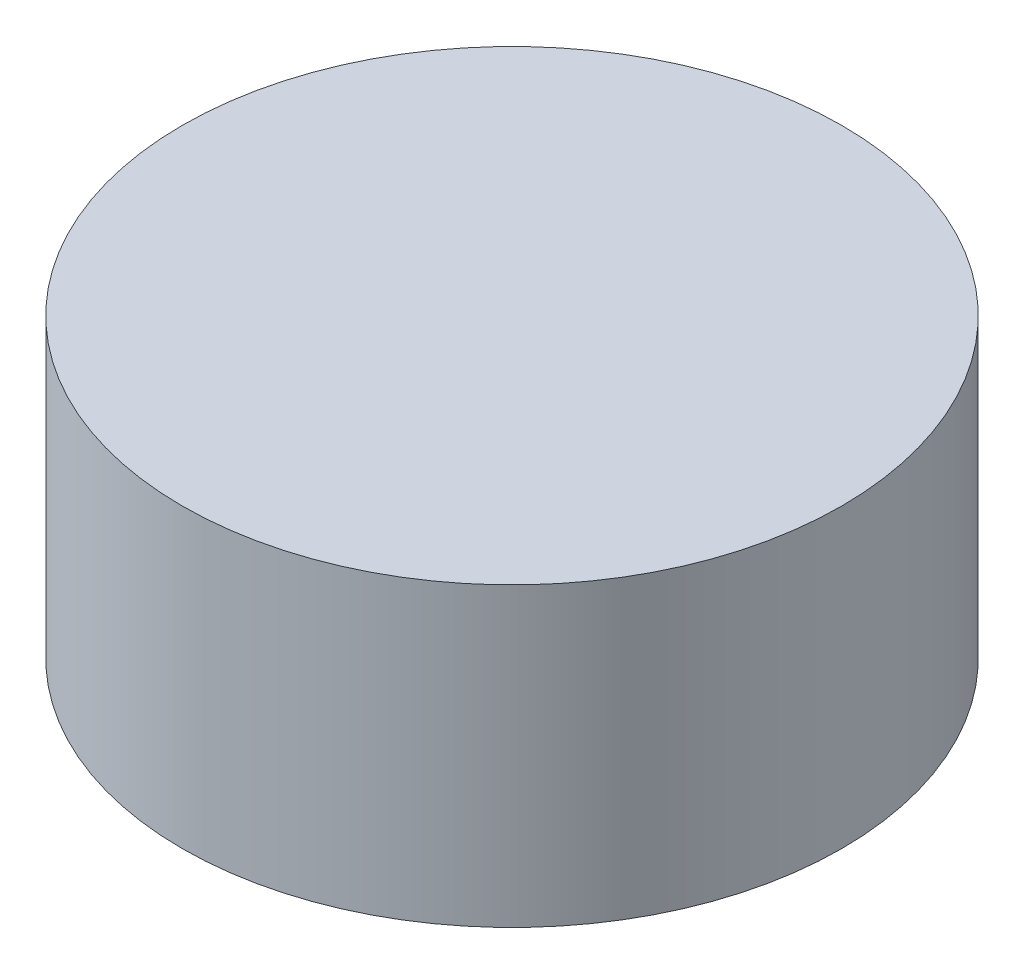
ISO-10303-21;
HEADER;
FILE_DESCRIPTION(('STEP AP214'),'2;1');
FILE_NAME('part.step','',(''),(''),'','','');
FILE_SCHEMA(('AUTOMOTIVE_DESIGN { 1 0 10303 214 1 1 1 1 }'));
ENDSEC;
DATA;
#1=APPLICATION_CONTEXT('core data for automotive mechanical design processes');
#2=APPLICATION_PROTOCOL_DEFINITION('international standard','automotive_design',2000,#1);
#3=PRODUCT_CONTEXT('',#1,'mechanical');
#4=PRODUCT('Part','Part','',(#3));
#5=PRODUCT_RELATED_PRODUCT_CATEGORY('part','',(#4));
#6=PRODUCT_DEFINITION_FORMATION('','',#4);
#7=PRODUCT_DEFINITION_CONTEXT('part definition',#1,'design');
#8=PRODUCT_DEFINITION('design','',#6,#7);
#9=PRODUCT_DEFINITION_SHAPE('','',#8);
#10=(LENGTH_UNIT() NAMED_UNIT(*) SI_UNIT(.MILLI.,.METRE.));
#11=(NAMED_UNIT(*) PLANE_ANGLE_UNIT() SI_UNIT($,.RADIAN.));
#12=(NAMED_UNIT(*) SI_UNIT($,.STERADIAN.) SOLID_ANGLE_UNIT());
#13=UNCERTAINTY_MEASURE_WITH_UNIT(LENGTH_MEASURE(1.E-05),#10,'distance_accuracy_value','');
#14=(GEOMETRIC_REPRESENTATION_CONTEXT(3) GLOBAL_UNCERTAINTY_ASSIGNED_CONTEXT((#13)) GLOBAL_UNIT_ASSIGNED_CONTEXT((#10,
#11,#12)) REPRESENTATION_CONTEXT('',''));
#15=CARTESIAN_POINT('',(0.,0.,0.));
#16=DIRECTION('',(0.,0.,1.));
#17=DIRECTION('',(1.,0.,0.));
#18=AXIS2_PLACEMENT_3D('',#15,#16,#17);
#19=CARTESIAN_POINT('',(0.,22.86,0.));
#20=DIRECTION('',(0.,-1.,0.));
#21=DIRECTION('',(0.,0.,-1.));
#22=AXIS2_PLACEMENT_3D('',#19,#20,#21);
#23=CYLINDRICAL_SURFACE('',#22,25.4);
#24=CARTESIAN_POINT('',(0.,22.86,0.));
#25=DIRECTION('',(0.,1.,0.));
#26=DIRECTION('',(0.,0.,1.));
#27=AXIS2_PLACEMENT_3D('',#24,#25,#26);
#28=CIRCLE('',#27,25.4);
#29=CARTESIAN_POINT('',(0.,22.86,25.4));
#30=VERTEX_POINT('',#29);
#31=EDGE_CURVE('E12',#30,#30,#28,.T.);
#32=ORIENTED_EDGE('',*,*,#31,.F.);
#33=EDGE_LOOP('',(#32));
#34=FACE_BOUND('',#33,.T.);
#35=CARTESIAN_POINT('',(0.,0.,0.));
#36=DIRECTION('',(0.,1.,0.));
#37=DIRECTION('',(0.,0.,1.));
#38=AXIS2_PLACEMENT_3D('',#35,#36,#37);
#39=CIRCLE('',#38,25.4);
#40=CARTESIAN_POINT('',(0.,0.,25.4));
#41=VERTEX_POINT('',#40);
#42=EDGE_CURVE('E43',#41,#41,#39,.T.);
#43=ORIENTED_EDGE('',*,*,#42,.T.);
#44=EDGE_LOOP('',(#43));
#45=FACE_BOUND('',#44,.T.);
#46=ADVANCED_FACE('F40',(#34,#45),#23,.T.);
#47=CARTESIAN_POINT('',(0.,22.86,0.));
#48=DIRECTION('',(0.,1.,0.));
#49=DIRECTION('',(0.,0.,1.));
#50=AXIS2_PLACEMENT_3D('',#47,#48,#49);
#51=PLANE('',#50);
#52=ORIENTED_EDGE('',*,*,#31,.T.);
#53=EDGE_LOOP('',(#52));
#54=FACE_BOUND('',#53,.T.);
#55=ADVANCED_FACE('F55',(#54),#51,.T.);
#56=CARTESIAN_POINT('',(0.,0.,0.));
#57=DIRECTION('',(0.,1.,0.));
#58=DIRECTION('',(0.,0.,1.));
#59=AXIS2_PLACEMENT_3D('',#56,#57,#58);
#60=PLANE('',#59);
#61=ORIENTED_EDGE('',*,*,#42,.F.);
#62=EDGE_LOOP('',(#61));
#63=FACE_BOUND('',#62,.T.);
#64=ADVANCED_FACE('F53',(#63),#60,.F.);
#65=CLOSED_SHELL('',(#46,#55,#64));
#66=MANIFOLD_SOLID_BREP('B2',#65);
#67=ADVANCED_BREP_SHAPE_REPRESENTATION('',(#18,#66),#14);
#68=SHAPE_DEFINITION_REPRESENTATION(#9,#67);
ENDSEC;
END-ISO-10303-21;
